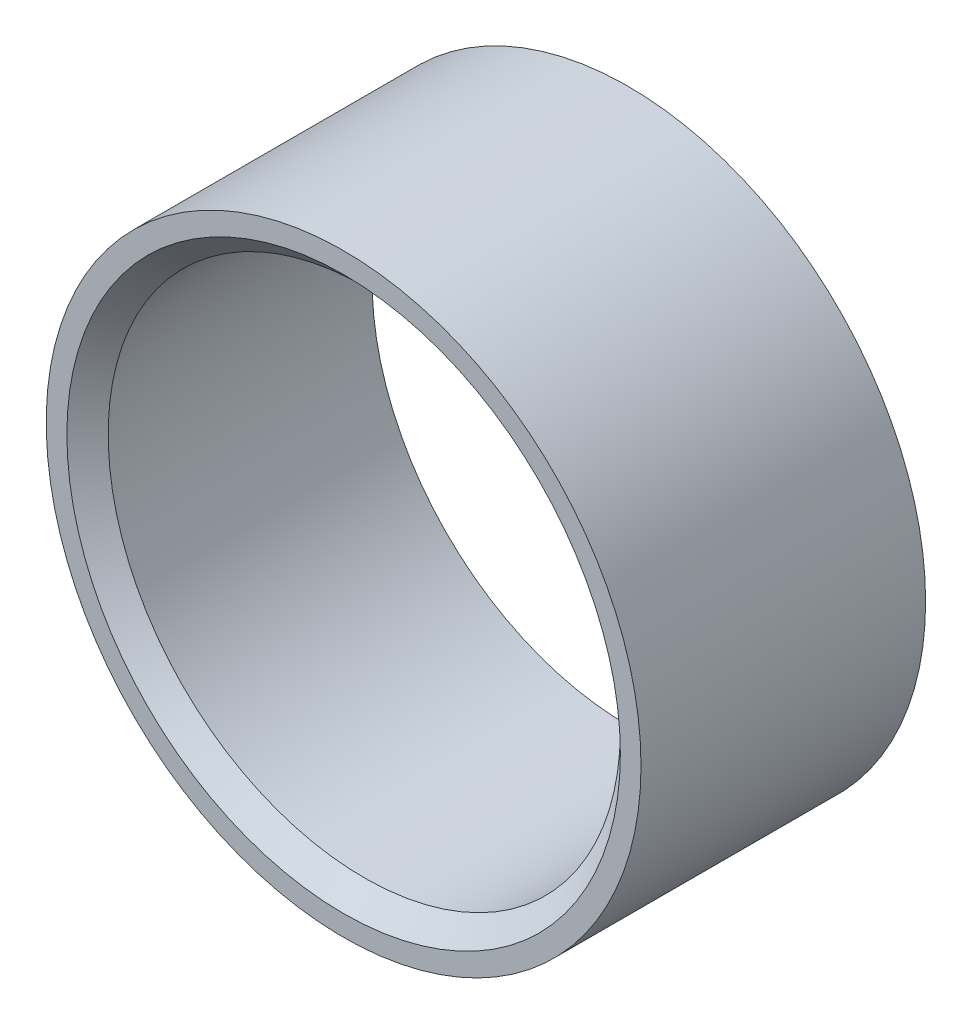
ISO-10303-21;
HEADER;
FILE_DESCRIPTION(('STEP AP214'),'2;1');
FILE_NAME('part.step','',(''),(''),'','','');
FILE_SCHEMA(('AUTOMOTIVE_DESIGN { 1 0 10303 214 1 1 1 1 }'));
ENDSEC;
DATA;
#1=APPLICATION_CONTEXT('core data for automotive mechanical design processes');
#2=APPLICATION_PROTOCOL_DEFINITION('international standard','automotive_design',2000,#1);
#3=PRODUCT_CONTEXT('',#1,'mechanical');
#4=PRODUCT('Part','Part','',(#3));
#5=PRODUCT_RELATED_PRODUCT_CATEGORY('part','',(#4));
#6=PRODUCT_DEFINITION_FORMATION('','',#4);
#7=PRODUCT_DEFINITION_CONTEXT('part definition',#1,'design');
#8=PRODUCT_DEFINITION('design','',#6,#7);
#9=PRODUCT_DEFINITION_SHAPE('','',#8);
#10=(LENGTH_UNIT() NAMED_UNIT(*) SI_UNIT(.MILLI.,.METRE.));
#11=(NAMED_UNIT(*) PLANE_ANGLE_UNIT() SI_UNIT($,.RADIAN.));
#12=(NAMED_UNIT(*) SI_UNIT($,.STERADIAN.) SOLID_ANGLE_UNIT());
#13=UNCERTAINTY_MEASURE_WITH_UNIT(LENGTH_MEASURE(1.E-05),#10,'distance_accuracy_value','');
#14=(GEOMETRIC_REPRESENTATION_CONTEXT(3) GLOBAL_UNCERTAINTY_ASSIGNED_CONTEXT((#13)) GLOBAL_UNIT_ASSIGNED_CONTEXT((#10,
#11,#12)) REPRESENTATION_CONTEXT('',''));
#15=CARTESIAN_POINT('',(0.,0.,0.));
#16=DIRECTION('',(0.,0.,1.));
#17=DIRECTION('',(1.,0.,0.));
#18=AXIS2_PLACEMENT_3D('',#15,#16,#17);
#19=CARTESIAN_POINT('',(0.,0.,17.5006));
#20=DIRECTION('',(0.,0.,1.));
#21=DIRECTION('',(1.,0.,0.));
#22=AXIS2_PLACEMENT_3D('',#19,#20,#21);
#23=PLANE('',#22);
#24=CARTESIAN_POINT('',(0.,0.,17.5006));
#25=DIRECTION('',(0.,0.,1.));
#26=DIRECTION('',(1.,0.,0.));
#27=AXIS2_PLACEMENT_3D('',#24,#25,#26);
#28=CIRCLE('',#27,17.018);
#29=CARTESIAN_POINT('',(17.018,0.,17.5006));
#30=VERTEX_POINT('',#29);
#31=EDGE_CURVE('E10',#30,#30,#28,.F.);
#32=ORIENTED_EDGE('',*,*,#31,.T.);
#33=EDGE_LOOP('',(#32));
#34=FACE_BOUND('',#33,.T.);
#35=CARTESIAN_POINT('',(0.,0.,17.5006));
#36=DIRECTION('',(0.,0.,1.));
#37=DIRECTION('',(1.,0.,0.));
#38=AXIS2_PLACEMENT_3D('',#35,#36,#37);
#39=CIRCLE('',#38,18.288);
#40=CARTESIAN_POINT('',(18.288,0.,17.5006));
#41=VERTEX_POINT('',#40);
#42=EDGE_CURVE('E53',#41,#41,#39,.T.);
#43=ORIENTED_EDGE('',*,*,#42,.T.);
#44=EDGE_LOOP('',(#43));
#45=FACE_BOUND('',#44,.T.);
#46=ADVANCED_FACE('F41',(#34,#45),#23,.T.);
#47=CARTESIAN_POINT('',(0.,0.,0.));
#48=DIRECTION('',(0.,0.,1.));
#49=DIRECTION('',(1.,0.,0.));
#50=AXIS2_PLACEMENT_3D('',#47,#48,#49);
#51=PLANE('',#50);
#52=CARTESIAN_POINT('',(0.,0.,0.));
#53=DIRECTION('',(0.,0.,1.));
#54=DIRECTION('',(1.,0.,0.));
#55=AXIS2_PLACEMENT_3D('',#52,#53,#54);
#56=CIRCLE('',#55,18.288);
#57=CARTESIAN_POINT('',(18.288,0.,0.));
#58=VERTEX_POINT('',#57);
#59=EDGE_CURVE('E57',#58,#58,#56,.T.);
#60=ORIENTED_EDGE('',*,*,#59,.F.);
#61=EDGE_LOOP('',(#60));
#62=FACE_BOUND('',#61,.T.);
#63=CARTESIAN_POINT('',(0.,0.,0.));
#64=DIRECTION('',(0.,0.,1.));
#65=DIRECTION('',(1.,0.,0.));
#66=AXIS2_PLACEMENT_3D('',#63,#64,#65);
#67=CIRCLE('',#66,15.748);
#68=CARTESIAN_POINT('',(15.748,0.,0.));
#69=VERTEX_POINT('',#68);
#70=EDGE_CURVE('E61',#69,#69,#67,.T.);
#71=ORIENTED_EDGE('',*,*,#70,.T.);
#72=EDGE_LOOP('',(#71));
#73=FACE_BOUND('',#72,.T.);
#74=ADVANCED_FACE('F66',(#62,#73),#51,.F.);
#75=CARTESIAN_POINT('',(0.,0.,17.5006));
#76=DIRECTION('',(0.,0.,-1.));
#77=DIRECTION('',(-1.,0.,0.));
#78=AXIS2_PLACEMENT_3D('',#75,#76,#77);
#79=CYLINDRICAL_SURFACE('',#78,18.288);
#80=ORIENTED_EDGE('',*,*,#42,.F.);
#81=EDGE_LOOP('',(#80));
#82=FACE_BOUND('',#81,.T.);
#83=ORIENTED_EDGE('',*,*,#59,.T.);
#84=EDGE_LOOP('',(#83));
#85=FACE_BOUND('',#84,.T.);
#86=ADVANCED_FACE('F70',(#82,#85),#79,.T.);
#87=CARTESIAN_POINT('',(0.,0.,17.5006));
#88=DIRECTION('',(0.,0.,-1.));
#89=DIRECTION('',(-1.,0.,0.));
#90=AXIS2_PLACEMENT_3D('',#87,#88,#89);
#91=CYLINDRICAL_SURFACE('',#90,15.748);
#92=CARTESIAN_POINT('',(0.,0.,16.2306));
#93=DIRECTION('',(0.,0.,1.));
#94=DIRECTION('',(1.,0.,0.));
#95=AXIS2_PLACEMENT_3D('',#92,#93,#94);
#96=CIRCLE('',#95,15.748);
#97=CARTESIAN_POINT('',(15.748,0.,16.2306));
#98=VERTEX_POINT('',#97);
#99=EDGE_CURVE('E49',#98,#98,#96,.T.);
#100=ORIENTED_EDGE('',*,*,#99,.T.);
#101=EDGE_LOOP('',(#100));
#102=FACE_BOUND('',#101,.T.);
#103=ORIENTED_EDGE('',*,*,#70,.F.);
#104=EDGE_LOOP('',(#103));
#105=FACE_BOUND('',#104,.T.);
#106=ADVANCED_FACE('F68',(#102,#105),#91,.F.);
#107=CARTESIAN_POINT('',(0.,0.,16.2306));
#108=DIRECTION('',(0.,0.,1.));
#109=DIRECTION('',(1.,0.,0.));
#110=AXIS2_PLACEMENT_3D('',#107,#108,#109);
#111=CONICAL_SURFACE('',#110,15.748,0.785398163397451);
#112=CARTESIAN_POINT('',(17.018,0.,17.5006));
#113=CARTESIAN_POINT('',(17.0047708333333,0.,17.4873708333333));
#114=CARTESIAN_POINT('',(16.9915416666667,0.,17.4741416666667));
#115=CARTESIAN_POINT('',(16.9650833333333,0.,17.4476833333333));
#116=CARTESIAN_POINT('',(16.9518541666667,0.,17.4344541666667));
#117=CARTESIAN_POINT('',(16.9253958333333,0.,17.4079958333333));
#118=CARTESIAN_POINT('',(16.9121666666667,0.,17.3947666666667));
#119=CARTESIAN_POINT('',(16.8857083333333,0.,17.3683083333333));
#120=CARTESIAN_POINT('',(16.8724791666667,0.,17.3550791666667));
#121=CARTESIAN_POINT('',(16.8460208333333,0.,17.3286208333333));
#122=CARTESIAN_POINT('',(16.8327916666667,0.,17.3153916666667));
#123=CARTESIAN_POINT('',(16.8063333333333,0.,17.2889333333333));
#124=CARTESIAN_POINT('',(16.7931041666667,0.,17.2757041666667));
#125=CARTESIAN_POINT('',(16.7666458333333,0.,17.2492458333333));
#126=CARTESIAN_POINT('',(16.7534166666667,0.,17.2360166666667));
#127=CARTESIAN_POINT('',(16.7269583333333,0.,17.2095583333333));
#128=CARTESIAN_POINT('',(16.7137291666667,0.,17.1963291666667));
#129=CARTESIAN_POINT('',(16.6872708333333,0.,17.1698708333333));
#130=CARTESIAN_POINT('',(16.6740416666667,0.,17.1566416666667));
#131=CARTESIAN_POINT('',(16.6475833333333,0.,17.1301833333333));
#132=CARTESIAN_POINT('',(16.6343541666667,0.,17.1169541666667));
#133=CARTESIAN_POINT('',(16.6078958333333,0.,17.0904958333333));
#134=CARTESIAN_POINT('',(16.5946666666667,0.,17.0772666666667));
#135=CARTESIAN_POINT('',(16.5682083333333,0.,17.0508083333333));
#136=CARTESIAN_POINT('',(16.5549791666667,0.,17.0375791666667));
#137=CARTESIAN_POINT('',(16.5285208333333,0.,17.0111208333333));
#138=CARTESIAN_POINT('',(16.5152916666667,0.,16.9978916666667));
#139=CARTESIAN_POINT('',(16.4888333333333,0.,16.9714333333333));
#140=CARTESIAN_POINT('',(16.4756041666667,0.,16.9582041666667));
#141=CARTESIAN_POINT('',(16.4491458333333,0.,16.9317458333333));
#142=CARTESIAN_POINT('',(16.4359166666667,0.,16.9185166666667));
#143=CARTESIAN_POINT('',(16.4094583333333,0.,16.8920583333333));
#144=CARTESIAN_POINT('',(16.3962291666667,0.,16.8788291666667));
#145=CARTESIAN_POINT('',(16.3697708333333,0.,16.8523708333333));
#146=CARTESIAN_POINT('',(16.3565416666667,0.,16.8391416666667));
#147=CARTESIAN_POINT('',(16.3300833333333,0.,16.8126833333333));
#148=CARTESIAN_POINT('',(16.3168541666667,0.,16.7994541666667));
#149=CARTESIAN_POINT('',(16.2903958333333,0.,16.7729958333333));
#150=CARTESIAN_POINT('',(16.2771666666667,0.,16.7597666666667));
#151=CARTESIAN_POINT('',(16.2507083333333,0.,16.7333083333333));
#152=CARTESIAN_POINT('',(16.2374791666667,0.,16.7200791666667));
#153=CARTESIAN_POINT('',(16.2110208333333,0.,16.6936208333333));
#154=CARTESIAN_POINT('',(16.1977916666667,0.,16.6803916666667));
#155=CARTESIAN_POINT('',(16.1713333333333,0.,16.6539333333333));
#156=CARTESIAN_POINT('',(16.1581041666667,0.,16.6407041666667));
#157=CARTESIAN_POINT('',(16.1316458333333,0.,16.6142458333333));
#158=CARTESIAN_POINT('',(16.1184166666667,0.,16.6010166666667));
#159=CARTESIAN_POINT('',(16.0919583333333,0.,16.5745583333333));
#160=CARTESIAN_POINT('',(16.0787291666667,0.,16.5613291666667));
#161=CARTESIAN_POINT('',(16.0522708333333,0.,16.5348708333333));
#162=CARTESIAN_POINT('',(16.0390416666667,0.,16.5216416666667));
#163=CARTESIAN_POINT('',(16.0125833333333,0.,16.4951833333333));
#164=CARTESIAN_POINT('',(15.9993541666667,0.,16.4819541666667));
#165=CARTESIAN_POINT('',(15.9728958333333,0.,16.4554958333333));
#166=CARTESIAN_POINT('',(15.9596666666667,0.,16.4422666666667));
#167=CARTESIAN_POINT('',(15.9332083333333,0.,16.4158083333333));
#168=CARTESIAN_POINT('',(15.9199791666667,0.,16.4025791666667));
#169=CARTESIAN_POINT('',(15.8935208333333,0.,16.3761208333333));
#170=CARTESIAN_POINT('',(15.8802916666667,0.,16.3628916666667));
#171=CARTESIAN_POINT('',(15.8538333333333,0.,16.3364333333333));
#172=CARTESIAN_POINT('',(15.8406041666667,0.,16.3232041666667));
#173=CARTESIAN_POINT('',(15.8141458333333,0.,16.2967458333333));
#174=CARTESIAN_POINT('',(15.8009166666667,0.,16.2835166666667));
#175=CARTESIAN_POINT('',(15.7744583333333,0.,16.2570583333333));
#176=CARTESIAN_POINT('',(15.7612291666667,0.,16.2438291666667));
#177=CARTESIAN_POINT('',(15.748,0.,16.2306));
#178=B_SPLINE_CURVE_WITH_KNOTS('',3,(#112,#113,#114,#115,#116,#117,#118,#119,#120,#121,#122,
#123,#124,#125,#126,#127,#128,#129,#130,#131,#132,#133,#134,#135,#136,#137,#138,#139,#140,#141,
#142,#143,#144,#145,#146,#147,#148,#149,#150,#151,#152,#153,#154,#155,#156,#157,#158,#159,#160,
#161,#162,#163,#164,#165,#166,#167,#168,#169,#170,#171,#172,#173,#174,#175,#176,#177),
.UNSPECIFIED.,.F.,.F.,(4,2,2,2,2,2,2,2,2,2,2,2,2,2,2,2,2,2,2,2,2,2,2,2,2,2,2,2,2,2,2,2,4),(0.,
0.0561266007566844,0.112253201513366,0.168379802270048,0.22450640302673,0.280633003783414,
0.336759604540099,0.392886205296781,0.449012806053463,0.505139406810145,0.561266007566829,
0.617392608323511,0.673519209080193,0.729645809836877,0.785772410593562,0.841899011350243,
0.898025612106925,0.954152212863607,1.01027881362029,1.06640541437697,1.12253201513366,
1.17865861589034,1.23478521664702,1.29091181740371,1.34703841816039,1.40316501891707,
1.45929161967375,1.51541822043044,1.57154482118712,1.6276714219438,1.68379802270048,
1.73992462345717,1.79605122421385),.UNSPECIFIED.);
#179=EDGE_CURVE('BSEAM44',#30,#98,#178,.T.);
#180=ORIENTED_EDGE('',*,*,#31,.F.);
#181=ORIENTED_EDGE('',*,*,#99,.F.);
#182=ORIENTED_EDGE('',*,*,#179,.T.);
#183=ORIENTED_EDGE('',*,*,#179,.F.);
#184=EDGE_LOOP('',(#180,#182,#181,#183));
#185=FACE_BOUND('',#184,.T.);
#186=ADVANCED_FACE('F44',(#185),#111,.F.);
#187=CLOSED_SHELL('',(#46,#74,#86,#106,#186));
#188=MANIFOLD_SOLID_BREP('B2',#187);
#189=ADVANCED_BREP_SHAPE_REPRESENTATION('',(#18,#188),#14);
#190=SHAPE_DEFINITION_REPRESENTATION(#9,#189);
ENDSEC;
END-ISO-10303-21;
